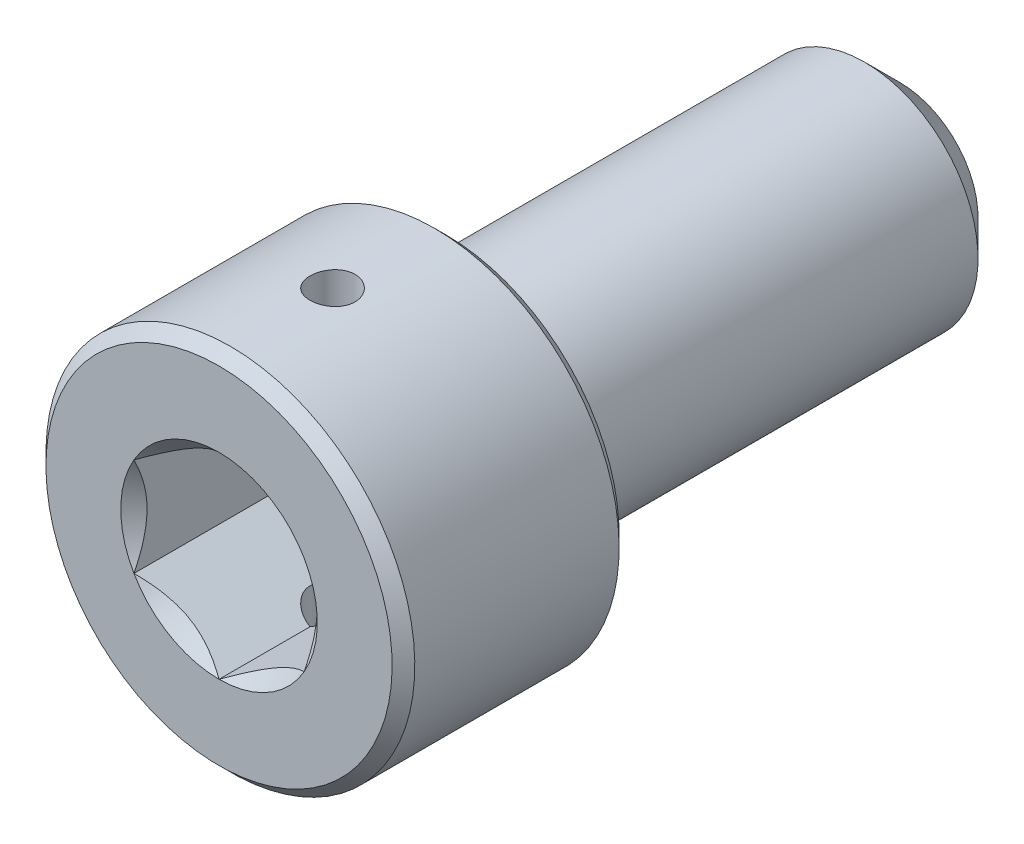
ISO-10303-21;
HEADER;
FILE_DESCRIPTION(('STEP AP214'),'2;1');
FILE_NAME('part.step','',(''),(''),'','','');
FILE_SCHEMA(('AUTOMOTIVE_DESIGN { 1 0 10303 214 1 1 1 1 }'));
ENDSEC;
DATA;
#1=APPLICATION_CONTEXT('core data for automotive mechanical design processes');
#2=APPLICATION_PROTOCOL_DEFINITION('international standard','automotive_design',2000,#1);
#3=PRODUCT_CONTEXT('',#1,'mechanical');
#4=PRODUCT('Part','Part','',(#3));
#5=PRODUCT_RELATED_PRODUCT_CATEGORY('part','',(#4));
#6=PRODUCT_DEFINITION_FORMATION('','',#4);
#7=PRODUCT_DEFINITION_CONTEXT('part definition',#1,'design');
#8=PRODUCT_DEFINITION('design','',#6,#7);
#9=PRODUCT_DEFINITION_SHAPE('','',#8);
#10=(LENGTH_UNIT() NAMED_UNIT(*) SI_UNIT(.MILLI.,.METRE.));
#11=(NAMED_UNIT(*) PLANE_ANGLE_UNIT() SI_UNIT($,.RADIAN.));
#12=(NAMED_UNIT(*) SI_UNIT($,.STERADIAN.) SOLID_ANGLE_UNIT());
#13=UNCERTAINTY_MEASURE_WITH_UNIT(LENGTH_MEASURE(1.E-05),#10,'distance_accuracy_value','');
#14=(GEOMETRIC_REPRESENTATION_CONTEXT(3) GLOBAL_UNCERTAINTY_ASSIGNED_CONTEXT((#13)) GLOBAL_UNIT_ASSIGNED_CONTEXT((#10,
#11,#12)) REPRESENTATION_CONTEXT('',''));
#15=CARTESIAN_POINT('',(0.,0.,0.));
#16=DIRECTION('',(0.,0.,1.));
#17=DIRECTION('',(1.,0.,0.));
#18=AXIS2_PLACEMENT_3D('',#15,#16,#17);
#19=CARTESIAN_POINT('',(0.,0.,-12.));
#20=DIRECTION('',(0.,0.,-1.));
#21=DIRECTION('',(0.,1.,0.));
#22=AXIS2_PLACEMENT_3D('',#19,#20,#21);
#23=CYLINDRICAL_SURFACE('',#22,6.5);
#24=CARTESIAN_POINT('',(0.,-6.5,7.20625));
#25=CARTESIAN_POINT('',(-0.0444079729155485,-6.49999939221956,7.20625189165239));
#26=CARTESIAN_POINT('',(-0.0888438999168541,-6.49954009733424,7.20998930580728));
#27=CARTESIAN_POINT('',(-0.176479831647115,-6.4977520563684,7.22483991313988));
#28=CARTESIAN_POINT('',(-0.21967848699375,-6.49642239612394,7.23596086158224));
#29=CARTESIAN_POINT('',(-0.303558433995981,-6.49304345604874,7.26524649888843));
#30=CARTESIAN_POINT('',(-0.344241377420885,-6.49099465442224,7.28340650785434));
#31=CARTESIAN_POINT('',(-0.421974268598821,-6.48640545434676,7.32624467486773));
#32=CARTESIAN_POINT('',(-0.459024850483202,-6.48386514193596,7.35092169239871));
#33=CARTESIAN_POINT('',(-0.528644217010037,-6.47856170874026,7.40623233750422));
#34=CARTESIAN_POINT('',(-0.561191129061601,-6.47579759729589,7.43689340381851));
#35=CARTESIAN_POINT('',(-0.620690939663912,-6.47036611160896,7.50324291360889));
#36=CARTESIAN_POINT('',(-0.647643556590281,-6.46769874224212,7.53893161003093));
#37=CARTESIAN_POINT('',(-0.695270708290707,-6.46275296282142,7.61446485426336));
#38=CARTESIAN_POINT('',(-0.715924830922818,-6.46047582766464,7.6543223635235));
#39=CARTESIAN_POINT('',(-0.750238346328536,-6.45658132712623,7.73697262771977));
#40=CARTESIAN_POINT('',(-0.763897992513902,-6.45496393784227,7.77976527625132));
#41=CARTESIAN_POINT('',(-0.783768525893049,-6.45258146551916,7.86684450333741));
#42=CARTESIAN_POINT('',(-0.790016274996747,-6.45181216600249,7.91112255304096));
#43=CARTESIAN_POINT('',(-0.794999712296952,-6.4512000530219,8.00010487217156));
#44=CARTESIAN_POINT('',(-0.79373568927032,-6.45135720394222,8.04480912514802));
#45=CARTESIAN_POINT('',(-0.783761737577462,-6.45257637760844,8.13311831925809));
#46=CARTESIAN_POINT('',(-0.775092368401077,-6.45363347121317,8.17672791903204));
#47=CARTESIAN_POINT('',(-0.750617076783878,-6.45652573353287,8.26186863690291));
#48=CARTESIAN_POINT('',(-0.734811015788588,-6.45836091735395,8.3033997146292));
#49=CARTESIAN_POINT('',(-0.696467273197893,-6.46260818144597,8.38333074451698));
#50=CARTESIAN_POINT('',(-0.67391191957528,-6.46502177284685,8.42172213565406));
#51=CARTESIAN_POINT('',(-0.622722504352283,-6.4701527204516,8.4941902076965));
#52=CARTESIAN_POINT('',(-0.594088177344442,-6.47287008991593,8.52826670011002));
#53=CARTESIAN_POINT('',(-0.53132863490993,-6.47832433417503,8.59137312271258));
#54=CARTESIAN_POINT('',(-0.497168450655344,-6.48106121941223,8.62036828672117));
#55=CARTESIAN_POINT('',(-0.424447406964582,-6.48622933073016,8.67221844575897));
#56=CARTESIAN_POINT('',(-0.385886538153272,-6.48866055615969,8.6950734277069));
#57=CARTESIAN_POINT('',(-0.305432260120137,-6.49294482676988,8.73399429961519));
#58=CARTESIAN_POINT('',(-0.263537812864568,-6.4947976909651,8.75005806496976));
#59=CARTESIAN_POINT('',(-0.177618561675765,-6.49771480868667,8.77491318171684));
#60=CARTESIAN_POINT('',(-0.133593852994679,-6.4987790974386,8.78370485795483));
#61=CARTESIAN_POINT('',(-0.0449644430967683,-6.4999945762374,8.79372129420934));
#62=CARTESIAN_POINT('',(-0.000365231700197217,-6.50015154653819,8.7949939567614));
#63=CARTESIAN_POINT('',(0.0884108371981461,-6.49955029509486,8.79006257893541));
#64=CARTESIAN_POINT('',(0.132587703256742,-6.49879209193216,8.78385869035915));
#65=CARTESIAN_POINT('',(0.219124107656301,-6.49644929915982,8.76419010425553));
#66=CARTESIAN_POINT('',(0.2614889017487,-6.49486730373612,8.75074819531731));
#67=CARTESIAN_POINT('',(0.343362876537072,-6.49105408547658,8.71700879285049));
#68=CARTESIAN_POINT('',(0.382871964266297,-6.4888228415165,8.69671107625484));
#69=CARTESIAN_POINT('',(0.458127279555294,-6.48394557258654,8.64971997271041));
#70=CARTESIAN_POINT('',(0.493853988825558,-6.48129755630257,8.6229955378111));
#71=CARTESIAN_POINT('',(0.560331944427385,-6.47588933049109,8.56395360522));
#72=CARTESIAN_POINT('',(0.591083002505686,-6.47312911672355,8.53163589600293));
#73=CARTESIAN_POINT('',(0.646906246143568,-6.46778980998977,8.46211403578312));
#74=CARTESIAN_POINT('',(0.671946717311331,-6.46521178089084,8.42488432584338));
#75=CARTESIAN_POINT('',(0.715419021008601,-6.46054608123354,8.34671956096686));
#76=CARTESIAN_POINT('',(0.733850980891948,-6.45845840122583,8.30578457745413));
#77=CARTESIAN_POINT('',(0.763531479775983,-6.45501695438462,8.22147440028328));
#78=CARTESIAN_POINT('',(0.774798024233719,-6.45366134927783,8.17810562348062));
#79=CARTESIAN_POINT('',(0.789885918467963,-6.45183221600156,8.0900741846122));
#80=CARTESIAN_POINT('',(0.793707597549751,-6.45135864881735,8.04541157986442));
#81=CARTESIAN_POINT('',(0.793791423265528,-6.45134830984382,7.95637576479737));
#82=CARTESIAN_POINT('',(0.790103392774313,-6.45180536388326,7.91200259383992));
#83=CARTESIAN_POINT('',(0.775377862822732,-6.45359150880796,7.824511754986));
#84=CARTESIAN_POINT('',(0.76434036148339,-6.45492059991616,7.78139408741051));
#85=CARTESIAN_POINT('',(0.735244558270641,-6.45829917942211,7.69764399596792));
#86=CARTESIAN_POINT('',(0.717188540715948,-6.46034843340743,7.65701076846398));
#87=CARTESIAN_POINT('',(0.674573164631947,-6.46493683843091,7.57934297473241));
#88=CARTESIAN_POINT('',(0.650013739340728,-6.46747599449817,7.5423084454532));
#89=CARTESIAN_POINT('',(0.594903512728122,-6.47277829353947,7.47263451789079));
#90=CARTESIAN_POINT('',(0.564315567679773,-6.47554275944227,7.44002459808981));
#91=CARTESIAN_POINT('',(0.498093754356882,-6.48097245227142,7.38038111468983));
#92=CARTESIAN_POINT('',(0.462458695913658,-6.48363765560272,7.35334887007675));
#93=CARTESIAN_POINT('',(0.387006293466619,-6.48857916507216,7.30554505173688));
#94=CARTESIAN_POINT('',(0.347174219029583,-6.49085402249052,7.2847965905581));
#95=CARTESIAN_POINT('',(0.264586060022864,-6.49474374491224,7.25031241759395));
#96=CARTESIAN_POINT('',(0.221833226028691,-6.49635933010261,7.23656904935486));
#97=CARTESIAN_POINT('',(0.149047066124777,-6.49835692423046,7.21979236925573));
#98=CARTESIAN_POINT('',(0.119473583368739,-6.49897009224667,7.21472123337664));
#99=CARTESIAN_POINT('',(0.0599376440854188,-6.49979183385601,7.20794942198299));
#100=CARTESIAN_POINT('',(0.0299751902515168,-6.50000041024918,7.20624872314279));
#101=CARTESIAN_POINT('',(0.,-6.5,7.20625));
#102=B_SPLINE_CURVE_WITH_KNOTS('',3,(#24,#25,#26,#27,#28,#29,#30,#31,#32,#33,#34,#35,#36,#37,
#38,#39,#40,#41,#42,#43,#44,#45,#46,#47,#48,#49,#50,#51,#52,#53,#54,#55,#56,#57,#58,#59,#60,#61,
#62,#63,#64,#65,#66,#67,#68,#69,#70,#71,#72,#73,#74,#75,#76,#77,#78,#79,#80,#81,#82,#83,#84,#85,
#86,#87,#88,#89,#90,#91,#92,#93,#94,#95,#96,#97,#98,#99,#100,#101),.UNSPECIFIED.,.T.,.F.,(4,2,2,
2,2,2,2,2,2,2,2,2,2,2,2,2,2,2,2,2,2,2,2,2,2,2,2,2,2,2,2,2,2,2,2,2,2,2,4),(0.,0.133114432934167,
0.266368903720819,0.399534932218744,0.532677671269972,0.666445897170282,0.800220855511473,
0.93442485355405,1.06862398900565,1.20215287011592,1.33567661797657,1.4684737038826,
1.60127336807312,1.73442383732924,1.86758012111941,2.0016146185421,2.13564940151465,
2.26972608577511,2.40379678048337,2.53701240144547,2.67022531768106,2.80302125051211,
2.93582150453355,3.06927669165344,3.20273692685682,3.33692121681087,3.47110292073573,
3.60494610285574,3.73878336461785,3.87173558167988,4.00468783273269,4.13759684795729,
4.27050722763638,4.40426366614131,4.53805169866482,4.67232600564711,4.80645323656826,
4.89630552671037,4.98615719501355),.UNSPECIFIED.);
#103=CARTESIAN_POINT('',(0.,-6.5,7.20625));
#104=VERTEX_POINT('',#103);
#105=EDGE_CURVE('E248',#104,#104,#102,.T.);
#106=ORIENTED_EDGE('',*,*,#105,.T.);
#107=EDGE_LOOP('',(#106));
#108=FACE_BOUND('',#107,.T.);
#109=CARTESIAN_POINT('',(0.,0.,11.6));
#110=DIRECTION('',(0.,0.,-1.));
#111=DIRECTION('',(0.,1.,0.));
#112=AXIS2_PLACEMENT_3D('',#109,#110,#111);
#113=CIRCLE('',#112,6.5);
#114=CARTESIAN_POINT('',(0.,6.5,11.6));
#115=VERTEX_POINT('',#114);
#116=EDGE_CURVE('E146',#115,#115,#113,.T.);
#117=ORIENTED_EDGE('',*,*,#116,.T.);
#118=EDGE_LOOP('',(#117));
#119=FACE_BOUND('',#118,.T.);
#120=CARTESIAN_POINT('',(0.,0.,4.4));
#121=DIRECTION('',(0.,0.,-1.));
#122=DIRECTION('',(0.,1.,0.));
#123=AXIS2_PLACEMENT_3D('',#120,#121,#122);
#124=CIRCLE('',#123,6.5);
#125=CARTESIAN_POINT('',(0.,6.5,4.4));
#126=VERTEX_POINT('',#125);
#127=EDGE_CURVE('E143',#126,#126,#124,.T.);
#128=ORIENTED_EDGE('',*,*,#127,.F.);
#129=EDGE_LOOP('',(#128));
#130=FACE_BOUND('',#129,.T.);
#131=CARTESIAN_POINT('',(0.,6.5,8.79375));
#132=CARTESIAN_POINT('',(-0.0444079729155484,6.49999939221956,8.79374810834761));
#133=CARTESIAN_POINT('',(-0.0888438999168541,6.49954009733424,8.79001069419272));
#134=CARTESIAN_POINT('',(-0.176479831647115,6.4977520563684,8.77516008686012));
#135=CARTESIAN_POINT('',(-0.219678486993749,6.49642239612394,8.76403913841776));
#136=CARTESIAN_POINT('',(-0.303558433995981,6.49304345604874,8.73475350111156));
#137=CARTESIAN_POINT('',(-0.344241377420886,6.49099465442224,8.71659349214566));
#138=CARTESIAN_POINT('',(-0.421974268598822,6.48640545434676,8.67375532513227));
#139=CARTESIAN_POINT('',(-0.459024850483202,6.48386514193596,8.64907830760129));
#140=CARTESIAN_POINT('',(-0.528644217010037,6.47856170874026,8.59376766249578));
#141=CARTESIAN_POINT('',(-0.561191129061602,6.47579759729589,8.56310659618149));
#142=CARTESIAN_POINT('',(-0.620690939663913,6.47036611160896,8.49675708639111));
#143=CARTESIAN_POINT('',(-0.647643556590282,6.46769874224212,8.46106838996907));
#144=CARTESIAN_POINT('',(-0.695270708290708,6.46275296282142,8.38553514573664));
#145=CARTESIAN_POINT('',(-0.715924830922819,6.46047582766464,8.3456776364765));
#146=CARTESIAN_POINT('',(-0.750238346328536,6.45658132712623,8.26302737228023));
#147=CARTESIAN_POINT('',(-0.763897992513902,6.45496393784227,8.22023472374868));
#148=CARTESIAN_POINT('',(-0.783768525893049,6.45258146551916,8.13315549666259));
#149=CARTESIAN_POINT('',(-0.790016274996747,6.45181216600249,8.08887744695904));
#150=CARTESIAN_POINT('',(-0.794999712296952,6.4512000530219,7.99989512782844));
#151=CARTESIAN_POINT('',(-0.79373568927032,6.45135720394222,7.95519087485198));
#152=CARTESIAN_POINT('',(-0.783761737577462,6.45257637760844,7.86688168074191));
#153=CARTESIAN_POINT('',(-0.775092368401077,6.45363347121317,7.82327208096796));
#154=CARTESIAN_POINT('',(-0.750617076783878,6.45652573353287,7.7381313630971));
#155=CARTESIAN_POINT('',(-0.734811015788588,6.45836091735395,7.6966002853708));
#156=CARTESIAN_POINT('',(-0.696467273197894,6.46260818144597,7.61666925548302));
#157=CARTESIAN_POINT('',(-0.673911919575281,6.46502177284685,7.57827786434594));
#158=CARTESIAN_POINT('',(-0.622722504352283,6.4701527204516,7.5058097923035));
#159=CARTESIAN_POINT('',(-0.594088177344442,6.47287008991593,7.47173329988998));
#160=CARTESIAN_POINT('',(-0.53132863490993,6.47832433417503,7.40862687728742));
#161=CARTESIAN_POINT('',(-0.497168450655344,6.48106121941223,7.37963171327883));
#162=CARTESIAN_POINT('',(-0.424447406964582,6.48622933073016,7.32778155424103));
#163=CARTESIAN_POINT('',(-0.385886538153272,6.48866055615969,7.3049265722931));
#164=CARTESIAN_POINT('',(-0.305432260120137,6.49294482676988,7.26600570038481));
#165=CARTESIAN_POINT('',(-0.263537812864568,6.4947976909651,7.24994193503024));
#166=CARTESIAN_POINT('',(-0.177618561675765,6.49771480868667,7.22508681828316));
#167=CARTESIAN_POINT('',(-0.133593852994679,6.4987790974386,7.21629514204517));
#168=CARTESIAN_POINT('',(-0.044964443096767,6.4999945762374,7.20627870579066));
#169=CARTESIAN_POINT('',(-0.000365231700196106,6.50015154653819,7.20500604323861));
#170=CARTESIAN_POINT('',(0.0884108371981468,6.49955029509486,7.20993742106459));
#171=CARTESIAN_POINT('',(0.132587703256743,6.49879209193216,7.21614130964085));
#172=CARTESIAN_POINT('',(0.219124107656302,6.49644929915982,7.23580989574447));
#173=CARTESIAN_POINT('',(0.261488901748701,6.49486730373612,7.24925180468269));
#174=CARTESIAN_POINT('',(0.343362876537073,6.49105408547658,7.28299120714952));
#175=CARTESIAN_POINT('',(0.382871964266298,6.4888228415165,7.30328892374516));
#176=CARTESIAN_POINT('',(0.458127279555295,6.48394557258654,7.35028002728959));
#177=CARTESIAN_POINT('',(0.493853988825559,6.48129755630257,7.3770044621889));
#178=CARTESIAN_POINT('',(0.560331944427387,6.47588933049109,7.43604639478));
#179=CARTESIAN_POINT('',(0.591083002505687,6.47312911672355,7.46836410399707));
#180=CARTESIAN_POINT('',(0.646906246143568,6.46778980998977,7.53788596421688));
#181=CARTESIAN_POINT('',(0.671946717311331,6.46521178089084,7.57511567415662));
#182=CARTESIAN_POINT('',(0.715419021008601,6.46054608123354,7.65328043903314));
#183=CARTESIAN_POINT('',(0.733850980891947,6.45845840122583,7.69421542254587));
#184=CARTESIAN_POINT('',(0.763531479775983,6.45501695438462,7.77852559971672));
#185=CARTESIAN_POINT('',(0.774798024233719,6.45366134927783,7.82189437651938));
#186=CARTESIAN_POINT('',(0.789885918467963,6.45183221600156,7.9099258153878));
#187=CARTESIAN_POINT('',(0.793707597549751,6.45135864881735,7.95458842013558));
#188=CARTESIAN_POINT('',(0.793791423265528,6.45134830984382,8.04362423520263));
#189=CARTESIAN_POINT('',(0.790103392774313,6.45180536388326,8.08799740616008));
#190=CARTESIAN_POINT('',(0.775377862822732,6.45359150880796,8.175488245014));
#191=CARTESIAN_POINT('',(0.76434036148339,6.45492059991616,8.21860591258949));
#192=CARTESIAN_POINT('',(0.735244558270641,6.45829917942211,8.30235600403208));
#193=CARTESIAN_POINT('',(0.717188540715949,6.46034843340743,8.34298923153602));
#194=CARTESIAN_POINT('',(0.674573164631948,6.46493683843091,8.42065702526759));
#195=CARTESIAN_POINT('',(0.650013739340728,6.46747599449817,8.4576915545468));
#196=CARTESIAN_POINT('',(0.59490351272812,6.47277829353947,8.52736548210921));
#197=CARTESIAN_POINT('',(0.564315567679772,6.47554275944227,8.55997540191019));
#198=CARTESIAN_POINT('',(0.498093754356881,6.48097245227142,8.61961888531017));
#199=CARTESIAN_POINT('',(0.462458695913657,6.48363765560272,8.64665112992325));
#200=CARTESIAN_POINT('',(0.387006293466618,6.48857916507216,8.69445494826312));
#201=CARTESIAN_POINT('',(0.347174219029583,6.49085402249052,8.7152034094419));
#202=CARTESIAN_POINT('',(0.264586060022864,6.49474374491224,8.74968758240606));
#203=CARTESIAN_POINT('',(0.221833226028691,6.49635933010261,8.76343095064514));
#204=CARTESIAN_POINT('',(0.149047066124777,6.49835692423046,8.78020763074427));
#205=CARTESIAN_POINT('',(0.119473583368739,6.49897009224667,8.78527876662336));
#206=CARTESIAN_POINT('',(0.059937644085419,6.49979183385601,8.79205057801701));
#207=CARTESIAN_POINT('',(0.029975190251517,6.50000041024918,8.79375127685721));
#208=CARTESIAN_POINT('',(0.,6.5,8.79375));
#209=B_SPLINE_CURVE_WITH_KNOTS('',3,(#131,#132,#133,#134,#135,#136,#137,#138,#139,#140,#141,
#142,#143,#144,#145,#146,#147,#148,#149,#150,#151,#152,#153,#154,#155,#156,#157,#158,#159,#160,
#161,#162,#163,#164,#165,#166,#167,#168,#169,#170,#171,#172,#173,#174,#175,#176,#177,#178,#179,
#180,#181,#182,#183,#184,#185,#186,#187,#188,#189,#190,#191,#192,#193,#194,#195,#196,#197,#198,
#199,#200,#201,#202,#203,#204,#205,#206,#207,#208),.UNSPECIFIED.,.T.,.F.,(4,2,2,2,2,2,2,2,2,2,2,
2,2,2,2,2,2,2,2,2,2,2,2,2,2,2,2,2,2,2,2,2,2,2,2,2,2,2,4),(0.,0.133114432934167,0.26636890372082,
0.399534932218745,0.532677671269972,0.666445897170285,0.800220855511474,0.934424853554051,
1.06862398900565,1.20215287011592,1.33567661797657,1.4684737038826,1.60127336807312,
1.73442383732924,1.86758012111941,2.0016146185421,2.13564940151465,2.26972608577511,
2.40379678048337,2.53701240144547,2.67022531768106,2.80302125051211,2.93582150453355,
3.06927669165344,3.20273692685682,3.33692121681087,3.47110292073573,3.60494610285574,
3.73878336461785,3.87173558167988,4.00468783273269,4.13759684795729,4.27050722763638,
4.4042636661413,4.53805169866482,4.67232600564711,4.80645323656826,4.89630552671037,
4.98615719501355),.UNSPECIFIED.);
#210=CARTESIAN_POINT('',(0.,6.5,8.79375));
#211=VERTEX_POINT('',#210);
#212=EDGE_CURVE('E254',#211,#211,#209,.T.);
#213=ORIENTED_EDGE('',*,*,#212,.T.);
#214=EDGE_LOOP('',(#213));
#215=FACE_BOUND('',#214,.T.);
#216=ADVANCED_FACE('F35',(#108,#119,#130,#215),#23,.T.);
#217=CARTESIAN_POINT('',(0.,0.,12.));
#218=DIRECTION('',(0.,0.,1.));
#219=DIRECTION('',(0.,-1.,0.));
#220=AXIS2_PLACEMENT_3D('',#217,#218,#219);
#221=PLANE('',#220);
#222=CARTESIAN_POINT('',(0.,0.,12.));
#223=DIRECTION('',(0.,0.,1.));
#224=DIRECTION('',(1.,0.,0.));
#225=AXIS2_PLACEMENT_3D('',#222,#223,#224);
#226=CIRCLE('',#225,3.46410161513775);
#227=CARTESIAN_POINT('',(0.,-3.46410161513776,12.));
#228=VERTEX_POINT('',#227);
#229=CARTESIAN_POINT('',(3.,-1.73205080756888,12.));
#230=VERTEX_POINT('',#229);
#231=EDGE_CURVE('E267',#228,#230,#226,.T.);
#232=ORIENTED_EDGE('',*,*,#231,.F.);
#233=CARTESIAN_POINT('',(-3.,-1.73205080756888,12.));
#234=VERTEX_POINT('',#233);
#235=EDGE_CURVE('E270',#234,#228,#226,.T.);
#236=ORIENTED_EDGE('',*,*,#235,.F.);
#237=CARTESIAN_POINT('',(-3.,1.73205080756888,12.));
#238=VERTEX_POINT('',#237);
#239=EDGE_CURVE('E266',#238,#234,#226,.T.);
#240=ORIENTED_EDGE('',*,*,#239,.F.);
#241=CARTESIAN_POINT('',(0.,3.46410161513775,12.));
#242=VERTEX_POINT('',#241);
#243=EDGE_CURVE('E261',#242,#238,#226,.T.);
#244=ORIENTED_EDGE('',*,*,#243,.F.);
#245=CARTESIAN_POINT('',(3.,1.73205080756888,12.));
#246=VERTEX_POINT('',#245);
#247=EDGE_CURVE('E260',#246,#242,#226,.T.);
#248=ORIENTED_EDGE('',*,*,#247,.F.);
#249=EDGE_CURVE('E259',#230,#246,#226,.T.);
#250=ORIENTED_EDGE('',*,*,#249,.F.);
#251=EDGE_LOOP('',(#232,#236,#240,#244,#248,#250));
#252=FACE_BOUND('',#251,.T.);
#253=CARTESIAN_POINT('',(0.,0.,12.));
#254=DIRECTION('',(0.,0.,-1.));
#255=DIRECTION('',(0.,1.,0.));
#256=AXIS2_PLACEMENT_3D('',#253,#254,#255);
#257=CIRCLE('',#256,6.1);
#258=CARTESIAN_POINT('',(0.,6.1,12.));
#259=VERTEX_POINT('',#258);
#260=EDGE_CURVE('E149',#259,#259,#257,.T.);
#261=ORIENTED_EDGE('',*,*,#260,.F.);
#262=EDGE_LOOP('',(#261));
#263=FACE_BOUND('',#262,.T.);
#264=ADVANCED_FACE('F37',(#252,#263),#221,.T.);
#265=CARTESIAN_POINT('',(0.,0.,11.6));
#266=DIRECTION('',(0.,0.,-1.));
#267=DIRECTION('',(0.,1.,0.));
#268=AXIS2_PLACEMENT_3D('',#265,#266,#267);
#269=CONICAL_SURFACE('',#268,6.5,0.785398163397452);
#270=ORIENTED_EDGE('',*,*,#260,.T.);
#271=EDGE_LOOP('',(#270));
#272=FACE_BOUND('',#271,.T.);
#273=ORIENTED_EDGE('',*,*,#116,.F.);
#274=EDGE_LOOP('',(#273));
#275=FACE_BOUND('',#274,.T.);
#276=ADVANCED_FACE('F241',(#272,#275),#269,.T.);
#277=CARTESIAN_POINT('',(0.,0.,4.));
#278=DIRECTION('',(0.,0.,1.));
#279=DIRECTION('',(0.,-1.,0.));
#280=AXIS2_PLACEMENT_3D('',#277,#278,#279);
#281=CONICAL_SURFACE('',#280,6.1,0.785398163397447);
#282=ORIENTED_EDGE('',*,*,#127,.T.);
#283=EDGE_LOOP('',(#282));
#284=FACE_BOUND('',#283,.T.);
#285=CARTESIAN_POINT('',(0.,0.,4.));
#286=DIRECTION('',(0.,0.,-1.));
#287=DIRECTION('',(0.,1.,0.));
#288=AXIS2_PLACEMENT_3D('',#285,#286,#287);
#289=CIRCLE('',#288,6.1);
#290=CARTESIAN_POINT('',(0.,6.1,4.));
#291=VERTEX_POINT('',#290);
#292=EDGE_CURVE('E140',#291,#291,#289,.T.);
#293=ORIENTED_EDGE('',*,*,#292,.F.);
#294=EDGE_LOOP('',(#293));
#295=FACE_BOUND('',#294,.T.);
#296=ADVANCED_FACE('F237',(#284,#295),#281,.T.);
#297=CARTESIAN_POINT('',(0.,6.1,4.));
#298=DIRECTION('',(0.,0.,-1.));
#299=DIRECTION('',(0.,1.,0.));
#300=AXIS2_PLACEMENT_3D('',#297,#298,#299);
#301=PLANE('',#300);
#302=ORIENTED_EDGE('',*,*,#292,.T.);
#303=EDGE_LOOP('',(#302));
#304=FACE_BOUND('',#303,.T.);
#305=CARTESIAN_POINT('',(0.,0.,4.));
#306=DIRECTION('',(0.,0.,-1.));
#307=DIRECTION('',(0.,1.,0.));
#308=AXIS2_PLACEMENT_3D('',#305,#306,#307);
#309=CIRCLE('',#308,4.);
#310=CARTESIAN_POINT('',(0.,4.,4.));
#311=VERTEX_POINT('',#310);
#312=EDGE_CURVE('E137',#311,#311,#309,.T.);
#313=ORIENTED_EDGE('',*,*,#312,.F.);
#314=EDGE_LOOP('',(#313));
#315=FACE_BOUND('',#314,.T.);
#316=ADVANCED_FACE('F233',(#304,#315),#301,.T.);
#317=CARTESIAN_POINT('',(0.,0.,-12.));
#318=DIRECTION('',(0.,0.,-1.));
#319=DIRECTION('',(0.,1.,0.));
#320=AXIS2_PLACEMENT_3D('',#317,#318,#319);
#321=CYLINDRICAL_SURFACE('',#320,4.);
#322=ORIENTED_EDGE('',*,*,#312,.T.);
#323=EDGE_LOOP('',(#322));
#324=FACE_BOUND('',#323,.T.);
#325=CARTESIAN_POINT('',(0.,0.,-10.75));
#326=DIRECTION('',(0.,0.,-1.));
#327=DIRECTION('',(0.,1.,0.));
#328=AXIS2_PLACEMENT_3D('',#325,#326,#327);
#329=CIRCLE('',#328,4.);
#330=CARTESIAN_POINT('',(0.,4.,-10.75));
#331=VERTEX_POINT('',#330);
#332=EDGE_CURVE('E134',#331,#331,#329,.T.);
#333=ORIENTED_EDGE('',*,*,#332,.F.);
#334=EDGE_LOOP('',(#333));
#335=FACE_BOUND('',#334,.T.);
#336=ADVANCED_FACE('F229',(#324,#335),#321,.T.);
#337=CARTESIAN_POINT('',(0.,0.,-12.));
#338=DIRECTION('',(0.,0.,1.));
#339=DIRECTION('',(0.,-1.,0.));
#340=AXIS2_PLACEMENT_3D('',#337,#338,#339);
#341=CONICAL_SURFACE('',#340,2.75,0.785398163397443);
#342=ORIENTED_EDGE('',*,*,#332,.T.);
#343=EDGE_LOOP('',(#342));
#344=FACE_BOUND('',#343,.T.);
#345=CARTESIAN_POINT('',(0.,0.,-12.));
#346=DIRECTION('',(0.,0.,-1.));
#347=DIRECTION('',(0.,1.,0.));
#348=AXIS2_PLACEMENT_3D('',#345,#346,#347);
#349=CIRCLE('',#348,2.75);
#350=CARTESIAN_POINT('',(0.,2.75,-12.));
#351=VERTEX_POINT('',#350);
#352=EDGE_CURVE('E130',#351,#351,#349,.T.);
#353=ORIENTED_EDGE('',*,*,#352,.F.);
#354=EDGE_LOOP('',(#353));
#355=FACE_BOUND('',#354,.T.);
#356=ADVANCED_FACE('F225',(#344,#355),#341,.T.);
#357=CARTESIAN_POINT('',(0.,2.75,-12.));
#358=DIRECTION('',(0.,0.,-1.));
#359=DIRECTION('',(0.,1.,0.));
#360=AXIS2_PLACEMENT_3D('',#357,#358,#359);
#361=PLANE('',#360);
#362=ORIENTED_EDGE('',*,*,#352,.T.);
#363=EDGE_LOOP('',(#362));
#364=FACE_BOUND('',#363,.T.);
#365=ADVANCED_FACE('F222',(#364),#361,.T.);
#366=CARTESIAN_POINT('',(0.,0.,12.));
#367=DIRECTION('',(0.,0.,1.));
#368=DIRECTION('',(1.,0.,0.));
#369=AXIS2_PLACEMENT_3D('',#366,#367,#368);
#370=CONICAL_SURFACE('',#369,3.46410161513775,0.78539816339745);
#371=ORIENTED_EDGE('',*,*,#231,.T.);
#372=CARTESIAN_POINT('',(-0.000199999999999171,-3.46421708519159,12.0001154758271));
#373=CARTESIAN_POINT('',(0.102923514955749,-3.40467869607211,11.9406283183218));
#374=CARTESIAN_POINT('',(0.207771389330651,-3.3441447475778,11.8846349794655));
#375=CARTESIAN_POINT('',(0.421567671781097,-3.2207094063533,11.7821125963789));
#376=CARTESIAN_POINT('',(0.530536411379761,-3.15779627521275,11.7356405937413));
#377=CARTESIAN_POINT('',(0.75026663959703,-3.03093496880241,11.6560331885163));
#378=CARTESIAN_POINT('',(0.860972171762213,-2.96701910000606,11.6226977006427));
#379=CARTESIAN_POINT('',(1.08482041056533,-2.83778025907546,11.5713375439793));
#380=CARTESIAN_POINT('',(1.19795627920699,-2.77246123486019,11.5532745375356));
#381=CARTESIAN_POINT('',(1.3929409561927,-2.65988677911464,11.5369769084505));
#382=CARTESIAN_POINT('',(1.47453795400214,-2.6127767304643,11.5345643671738));
#383=CARTESIAN_POINT('',(1.63759922883009,-2.51863325954798,11.5386294346571));
#384=CARTESIAN_POINT('',(1.71906344929899,-2.47159986993094,11.5451101600283));
#385=CARTESIAN_POINT('',(1.88122011233837,-2.37797867687426,11.5665917225152));
#386=CARTESIAN_POINT('',(1.9619115887843,-2.33139143122689,11.5816020899673));
#387=CARTESIAN_POINT('',(2.12190869789134,-2.23901705721438,11.619323646066));
#388=CARTESIAN_POINT('',(2.2012144363093,-2.19322986779049,11.6420342443228));
#389=CARTESIAN_POINT('',(2.34200614080275,-2.11194373930153,11.6887606848539));
#390=CARTESIAN_POINT('',(2.40380372214603,-2.07626488907772,11.7115483276808));
#391=CARTESIAN_POINT('',(2.52628941752022,-2.00554773988155,11.7607962860574));
#392=CARTESIAN_POINT('',(2.5869774976356,-1.97050946049033,11.7872567136662));
#393=CARTESIAN_POINT('',(2.70705299739086,-1.90118383838356,11.8432569943914));
#394=CARTESIAN_POINT('',(2.76644383229592,-1.86689452386373,11.8727871644784));
#395=CARTESIAN_POINT('',(2.88412556146727,-1.79895094584795,11.9345390915755));
#396=CARTESIAN_POINT('',(2.94241710424774,-1.76529630793217,11.9667591966594));
#397=CARTESIAN_POINT('',(3.0002,-1.73193533751504,12.0001154758271));
#398=B_SPLINE_CURVE_WITH_KNOTS('',3,(#372,#373,#374,#375,#376,#377,#378,#379,#380,#381,#382,
#383,#384,#385,#386,#387,#388,#389,#390,#391,#392,#393,#394,#395,#396,#397),.UNSPECIFIED.,.F.,
.F.,(4,2,2,2,2,2,2,2,2,2,2,2,4),(0.,0.399603557139306,0.801535286397845,1.19708369162343,
1.59163620080173,1.87398941755844,2.15644160919093,2.43921001247425,2.72195674032138,
2.94657516661927,3.17120044767274,3.3951375283781,3.61893808380739),.UNSPECIFIED.);
#399=EDGE_CURVE('E43',#228,#230,#398,.T.);
#400=ORIENTED_EDGE('',*,*,#399,.F.);
#401=EDGE_LOOP('',(#371,#400));
#402=FACE_BOUND('',#401,.T.);
#403=ADVANCED_FACE('F168',(#402),#370,.F.);
#404=ORIENTED_EDGE('',*,*,#235,.T.);
#405=CARTESIAN_POINT('',(-3.0002,-1.73193533751504,12.0001154758271));
#406=CARTESIAN_POINT('',(-2.89707648504425,-1.79147372663452,11.9406283183218));
#407=CARTESIAN_POINT('',(-2.79222861066935,-1.85200767512883,11.8846349794655));
#408=CARTESIAN_POINT('',(-2.5784323282189,-1.97544301635334,11.7821125963789));
#409=CARTESIAN_POINT('',(-2.46946358862024,-2.03835614749388,11.7356405937413));
#410=CARTESIAN_POINT('',(-2.24973336040297,-2.16521745390422,11.6560331885163));
#411=CARTESIAN_POINT('',(-2.13902782823779,-2.22913332270057,11.6226977006427));
#412=CARTESIAN_POINT('',(-1.91517958943467,-2.35837216363117,11.5713375439793));
#413=CARTESIAN_POINT('',(-1.802043720793,-2.42369118784644,11.5532745375356));
#414=CARTESIAN_POINT('',(-1.60705904380729,-2.53626564359199,11.5369769084505));
#415=CARTESIAN_POINT('',(-1.52546204599786,-2.58337569224233,11.5345643671738));
#416=CARTESIAN_POINT('',(-1.36240077116991,-2.67751916315866,11.5386294346571));
#417=CARTESIAN_POINT('',(-1.28093655070101,-2.7245525527757,11.5451101600283));
#418=CARTESIAN_POINT('',(-1.11877988766163,-2.81817374583238,11.5665917225152));
#419=CARTESIAN_POINT('',(-1.03808841121569,-2.86476099147974,11.5816020899673));
#420=CARTESIAN_POINT('',(-0.87809130210866,-2.95713536549225,11.619323646066));
#421=CARTESIAN_POINT('',(-0.798785563690699,-3.00292255491614,11.6420342443228));
#422=CARTESIAN_POINT('',(-0.657993859197243,-3.08420868340511,11.6887606848539));
#423=CARTESIAN_POINT('',(-0.59619627785397,-3.11988753362891,11.7115483276808));
#424=CARTESIAN_POINT('',(-0.473710582479777,-3.19060468282508,11.7607962860574));
#425=CARTESIAN_POINT('',(-0.413022502364393,-3.2256429622163,11.7872567136662));
#426=CARTESIAN_POINT('',(-0.292947002609134,-3.29496858432308,11.8432569943914));
#427=CARTESIAN_POINT('',(-0.233556167704079,-3.32925789884291,11.8727871644784));
#428=CARTESIAN_POINT('',(-0.115874438532729,-3.39720147685869,11.9345390915755));
#429=CARTESIAN_POINT('',(-0.057582895752264,-3.43085611477447,11.9667591966594));
#430=CARTESIAN_POINT('',(0.000200000000001291,-3.46421708519159,12.0001154758271));
#431=B_SPLINE_CURVE_WITH_KNOTS('',3,(#405,#406,#407,#408,#409,#410,#411,#412,#413,#414,#415,
#416,#417,#418,#419,#420,#421,#422,#423,#424,#425,#426,#427,#428,#429,#430),.UNSPECIFIED.,.F.,
.F.,(4,2,2,2,2,2,2,2,2,2,2,2,4),(0.,0.399603557139308,0.801535286397846,1.19708369162343,
1.59163620080173,1.87398941755845,2.15644160919093,2.43921001247425,2.72195674032138,
2.94657516661927,3.17120044767274,3.3951375283781,3.61893808380739),.UNSPECIFIED.);
#432=EDGE_CURVE('E177',#234,#228,#431,.T.);
#433=ORIENTED_EDGE('',*,*,#432,.F.);
#434=EDGE_LOOP('',(#404,#433));
#435=FACE_BOUND('',#434,.T.);
#436=ADVANCED_FACE('F295',(#435),#370,.F.);
#437=ORIENTED_EDGE('',*,*,#239,.T.);
#438=CARTESIAN_POINT('',(-3.,-3.45441625939385,13.1111570325416));
#439=CARTESIAN_POINT('',(-3.,-3.37030502107637,13.0476657232794));
#440=CARTESIAN_POINT('',(-3.,-3.28572284861355,12.9847881417678));
#441=CARTESIAN_POINT('',(-3.,-3.11543086688957,12.8605352202182));
#442=CARTESIAN_POINT('',(-3.,-3.02972077988559,12.7991602612535));
#443=CARTESIAN_POINT('',(-3.,-2.8563602330365,12.6777509975778));
#444=CARTESIAN_POINT('',(-3.,-2.76869988431322,12.6177307653415));
#445=CARTESIAN_POINT('',(-3.,-2.5918912487671,12.4999306126985));
#446=CARTESIAN_POINT('',(-3.,-2.50274306770574,12.4421505340141));
#447=CARTESIAN_POINT('',(-3.,-2.31756329845857,12.3260958713429));
#448=CARTESIAN_POINT('',(-3.,-2.22143002198058,12.2679827190468));
#449=CARTESIAN_POINT('',(-3.,-2.02694739151964,12.1555968716429));
#450=CARTESIAN_POINT('',(-3.,-1.92859833207453,12.101323670026));
#451=CARTESIAN_POINT('',(-3.,-1.7296520236116,11.9977624496109));
#452=CARTESIAN_POINT('',(-3.,-1.62906211119816,11.9484604472253));
#453=CARTESIAN_POINT('',(-3.,-1.42513893302447,11.855954239299));
#454=CARTESIAN_POINT('',(-3.,-1.3218069347663,11.8127472727735));
#455=CARTESIAN_POINT('',(-3.,-1.12067434078031,11.7371396932414));
#456=CARTESIAN_POINT('',(-3.,-1.02309778507454,11.7041492645284));
#457=CARTESIAN_POINT('',(-3.,-0.825595420969993,11.6459965369441));
#458=CARTESIAN_POINT('',(-3.,-0.725669451239074,11.620834777359));
#459=CARTESIAN_POINT('',(-3.,-0.525726947792027,11.5800719953195));
#460=CARTESIAN_POINT('',(-3.,-0.425744363617326,11.5643071649568));
#461=CARTESIAN_POINT('',(-3.,-0.224710351161197,11.5426442284558));
#462=CARTESIAN_POINT('',(-3.,-0.123659109618513,11.5367444262465));
#463=CARTESIAN_POINT('',(-3.,0.0748582819677248,11.5352497065848));
#464=CARTESIAN_POINT('',(-3.,0.172321806608346,11.5392895256711));
#465=CARTESIAN_POINT('',(-3.,0.366414003342317,11.5566450472329));
#466=CARTESIAN_POINT('',(-3.,0.463042593410416,11.5699616508163));
#467=CARTESIAN_POINT('',(-3.,0.656399252511054,11.6053707356158));
#468=CARTESIAN_POINT('',(-3.,0.753099531688679,11.6276125600194));
#469=CARTESIAN_POINT('',(-3.,0.944393095040882,11.6796858906705));
#470=CARTESIAN_POINT('',(-3.,1.03898655479587,11.7095167618603));
#471=CARTESIAN_POINT('',(-3.,1.23463961000382,11.7786113636965));
#472=CARTESIAN_POINT('',(-3.,1.33547771428671,11.8184959734906));
#473=CARTESIAN_POINT('',(-3.,1.53452137874292,11.9043830232129));
#474=CARTESIAN_POINT('',(-3.,1.63272604345161,11.9503875132043));
#475=CARTESIAN_POINT('',(-3.,1.82700394280657,12.0474277014878));
#476=CARTESIAN_POINT('',(-3.,1.92306904045365,12.0984795592876));
#477=CARTESIAN_POINT('',(-3.,2.11298650428611,12.2044820100323));
#478=CARTESIAN_POINT('',(-3.,2.20683926516496,12.259431900424));
#479=CARTESIAN_POINT('',(-3.,2.38800606865125,12.3696520775105));
#480=CARTESIAN_POINT('',(-3.,2.47541308656128,12.4247703488088));
#481=CARTESIAN_POINT('',(-3.,2.64872655468151,12.5373247081957));
#482=CARTESIAN_POINT('',(-3.,2.73463289052352,12.5947609718457));
#483=CARTESIAN_POINT('',(-3.,2.90444477939853,12.7110625667455));
#484=CARTESIAN_POINT('',(-3.,2.9883609164946,12.7699124995692));
#485=CARTESIAN_POINT('',(-3.,3.15504638145619,12.8891686606219));
#486=CARTESIAN_POINT('',(-3.,3.23781601834663,12.9495744564211));
#487=CARTESIAN_POINT('',(-3.,3.32010556038988,13.0106163572189));
#488=B_SPLINE_CURVE_WITH_KNOTS('',3,(#438,#439,#440,#441,#442,#443,#444,#445,#446,#447,#448,
#449,#450,#451,#452,#453,#454,#455,#456,#457,#458,#459,#460,#461,#462,#463,#464,#465,#466,#467,
#468,#469,#470,#471,#472,#473,#474,#475,#476,#477,#478,#479,#480,#481,#482,#483,#484,#485,#486,
#487),.UNSPECIFIED.,.F.,.F.,(4,2,2,2,2,2,2,2,2,2,2,2,2,2,2,2,2,2,2,2,2,2,2,2,4),(0.,
0.316159097965336,0.632397561987884,0.951086331935232,1.26975254380525,1.60668135057622,
1.94356563154894,2.27947417466659,2.61523006286276,2.92396665219119,3.23272450446297,
3.53592945807761,3.83908227702018,4.13126225384143,4.42347061576031,4.72078712232687,
5.01807875738361,5.34314370606637,5.66831782186803,5.99456896834931,6.32076146236873,
6.63072186382905,6.94070578545817,7.24817167021369,7.55555300225563),.UNSPECIFIED.);
#489=EDGE_CURVE('E185',#238,#234,#488,.F.);
#490=ORIENTED_EDGE('',*,*,#489,.F.);
#491=EDGE_LOOP('',(#437,#490));
#492=FACE_BOUND('',#491,.T.);
#493=ADVANCED_FACE('F282',(#492),#370,.F.);
#494=ORIENTED_EDGE('',*,*,#243,.T.);
#495=CARTESIAN_POINT('',(0.000199999999999346,3.46421708519159,12.0001154758271));
#496=CARTESIAN_POINT('',(-0.102923514955749,3.40467869607211,11.9406283183218));
#497=CARTESIAN_POINT('',(-0.207771389330651,3.3441447475778,11.8846349794655));
#498=CARTESIAN_POINT('',(-0.421567671781097,3.22070940635329,11.7821125963789));
#499=CARTESIAN_POINT('',(-0.530536411379761,3.15779627521275,11.7356405937413));
#500=CARTESIAN_POINT('',(-0.75026663959703,3.03093496880241,11.6560331885163));
#501=CARTESIAN_POINT('',(-0.860972171762213,2.96701910000606,11.6226977006427));
#502=CARTESIAN_POINT('',(-1.08482041056533,2.83778025907546,11.5713375439793));
#503=CARTESIAN_POINT('',(-1.197956279207,2.77246123486019,11.5532745375356));
#504=CARTESIAN_POINT('',(-1.3929409561927,2.65988677911464,11.5369769084505));
#505=CARTESIAN_POINT('',(-1.47453795400214,2.6127767304643,11.5345643671738));
#506=CARTESIAN_POINT('',(-1.63759922883009,2.51863325954798,11.5386294346571));
#507=CARTESIAN_POINT('',(-1.71906344929899,2.47159986993093,11.5451101600283));
#508=CARTESIAN_POINT('',(-1.88122011233837,2.37797867687426,11.5665917225152));
#509=CARTESIAN_POINT('',(-1.9619115887843,2.33139143122689,11.5816020899673));
#510=CARTESIAN_POINT('',(-2.12190869789134,2.23901705721438,11.619323646066));
#511=CARTESIAN_POINT('',(-2.2012144363093,2.19322986779049,11.6420342443228));
#512=CARTESIAN_POINT('',(-2.34200614080275,2.11194373930153,11.6887606848539));
#513=CARTESIAN_POINT('',(-2.40380372214603,2.07626488907772,11.7115483276808));
#514=CARTESIAN_POINT('',(-2.52628941752022,2.00554773988155,11.7607962860574));
#515=CARTESIAN_POINT('',(-2.5869774976356,1.97050946049033,11.7872567136662));
#516=CARTESIAN_POINT('',(-2.70705299739086,1.90118383838356,11.8432569943914));
#517=CARTESIAN_POINT('',(-2.76644383229592,1.86689452386373,11.8727871644784));
#518=CARTESIAN_POINT('',(-2.88412556146727,1.79895094584795,11.9345390915755));
#519=CARTESIAN_POINT('',(-2.94241710424773,1.76529630793217,11.9667591966594));
#520=CARTESIAN_POINT('',(-3.0002,1.73193533751504,12.0001154758271));
#521=B_SPLINE_CURVE_WITH_KNOTS('',3,(#495,#496,#497,#498,#499,#500,#501,#502,#503,#504,#505,
#506,#507,#508,#509,#510,#511,#512,#513,#514,#515,#516,#517,#518,#519,#520),.UNSPECIFIED.,.F.,
.F.,(4,2,2,2,2,2,2,2,2,2,2,2,4),(0.,0.399603557139307,0.801535286397845,1.19708369162343,
1.59163620080173,1.87398941755844,2.15644160919093,2.43921001247425,2.72195674032138,
2.94657516661927,3.17120044767274,3.3951375283781,3.61893808380739),.UNSPECIFIED.);
#522=EDGE_CURVE('E192',#242,#238,#521,.T.);
#523=ORIENTED_EDGE('',*,*,#522,.F.);
#524=EDGE_LOOP('',(#494,#523));
#525=FACE_BOUND('',#524,.T.);
#526=ADVANCED_FACE('F287',(#525),#370,.F.);
#527=ORIENTED_EDGE('',*,*,#247,.T.);
#528=CARTESIAN_POINT('',(3.0002,1.73193533751504,12.0001154758271));
#529=CARTESIAN_POINT('',(2.89707648504425,1.79147372663452,11.9406283183218));
#530=CARTESIAN_POINT('',(2.79222861066935,1.85200767512883,11.8846349794655));
#531=CARTESIAN_POINT('',(2.5784323282189,1.97544301635334,11.7821125963789));
#532=CARTESIAN_POINT('',(2.46946358862024,2.03835614749388,11.7356405937413));
#533=CARTESIAN_POINT('',(2.24973336040297,2.16521745390422,11.6560331885163));
#534=CARTESIAN_POINT('',(2.13902782823779,2.22913332270057,11.6226977006427));
#535=CARTESIAN_POINT('',(1.91517958943467,2.35837216363117,11.5713375439793));
#536=CARTESIAN_POINT('',(1.802043720793,2.42369118784644,11.5532745375356));
#537=CARTESIAN_POINT('',(1.60705904380729,2.53626564359199,11.5369769084505));
#538=CARTESIAN_POINT('',(1.52546204599786,2.58337569224233,11.5345643671738));
#539=CARTESIAN_POINT('',(1.36240077116991,2.67751916315866,11.5386294346571));
#540=CARTESIAN_POINT('',(1.28093655070101,2.7245525527757,11.5451101600283));
#541=CARTESIAN_POINT('',(1.11877988766163,2.81817374583238,11.5665917225152));
#542=CARTESIAN_POINT('',(1.03808841121569,2.86476099147974,11.5816020899673));
#543=CARTESIAN_POINT('',(0.87809130210866,2.95713536549225,11.619323646066));
#544=CARTESIAN_POINT('',(0.798785563690699,3.00292255491614,11.6420342443228));
#545=CARTESIAN_POINT('',(0.657993859197242,3.08420868340511,11.6887606848539));
#546=CARTESIAN_POINT('',(0.59619627785397,3.11988753362891,11.7115483276808));
#547=CARTESIAN_POINT('',(0.473710582479776,3.19060468282508,11.7607962860574));
#548=CARTESIAN_POINT('',(0.413022502364393,3.2256429622163,11.7872567136662));
#549=CARTESIAN_POINT('',(0.292947002609134,3.29496858432308,11.8432569943914));
#550=CARTESIAN_POINT('',(0.233556167704079,3.32925789884291,11.8727871644784));
#551=CARTESIAN_POINT('',(0.115874438532729,3.39720147685869,11.9345390915755));
#552=CARTESIAN_POINT('',(0.0575828957522643,3.43085611477447,11.9667591966594));
#553=CARTESIAN_POINT('',(-0.00020000000000095,3.46421708519159,12.0001154758271));
#554=B_SPLINE_CURVE_WITH_KNOTS('',3,(#528,#529,#530,#531,#532,#533,#534,#535,#536,#537,#538,
#539,#540,#541,#542,#543,#544,#545,#546,#547,#548,#549,#550,#551,#552,#553),.UNSPECIFIED.,.F.,
.F.,(4,2,2,2,2,2,2,2,2,2,2,2,4),(0.,0.399603557139308,0.801535286397848,1.19708369162343,
1.59163620080173,1.87398941755845,2.15644160919093,2.43921001247426,2.72195674032139,
2.94657516661927,3.17120044767275,3.3951375283781,3.61893808380739),.UNSPECIFIED.);
#555=EDGE_CURVE('E113',#246,#242,#554,.T.);
#556=ORIENTED_EDGE('',*,*,#555,.F.);
#557=EDGE_LOOP('',(#527,#556));
#558=FACE_BOUND('',#557,.T.);
#559=ADVANCED_FACE('F166',(#558),#370,.F.);
#560=ORIENTED_EDGE('',*,*,#249,.T.);
#561=CARTESIAN_POINT('',(3.,-3.45441625939385,13.1111570325416));
#562=CARTESIAN_POINT('',(3.,-3.37030502107637,13.0476657232794));
#563=CARTESIAN_POINT('',(3.,-3.28572284861355,12.9847881417678));
#564=CARTESIAN_POINT('',(3.,-3.11543086688957,12.8605352202182));
#565=CARTESIAN_POINT('',(3.,-3.02972077988559,12.7991602612535));
#566=CARTESIAN_POINT('',(3.,-2.8563602330365,12.6777509975778));
#567=CARTESIAN_POINT('',(3.,-2.76869988431322,12.6177307653415));
#568=CARTESIAN_POINT('',(3.,-2.5918912487671,12.4999306126985));
#569=CARTESIAN_POINT('',(3.,-2.50274306770574,12.4421505340141));
#570=CARTESIAN_POINT('',(3.,-2.31756329845856,12.3260958713429));
#571=CARTESIAN_POINT('',(3.,-2.22143002198058,12.2679827190468));
#572=CARTESIAN_POINT('',(3.,-2.02694739151963,12.1555968716429));
#573=CARTESIAN_POINT('',(3.,-1.92859833207452,12.101323670026));
#574=CARTESIAN_POINT('',(3.,-1.7296520236116,11.9977624496109));
#575=CARTESIAN_POINT('',(3.,-1.62906211119816,11.9484604472253));
#576=CARTESIAN_POINT('',(3.,-1.42513893302447,11.855954239299));
#577=CARTESIAN_POINT('',(3.,-1.3218069347663,11.8127472727735));
#578=CARTESIAN_POINT('',(3.,-1.12067434078031,11.7371396932414));
#579=CARTESIAN_POINT('',(3.,-1.02309778507454,11.7041492645284));
#580=CARTESIAN_POINT('',(3.,-0.825595420969991,11.6459965369441));
#581=CARTESIAN_POINT('',(3.,-0.725669451239073,11.620834777359));
#582=CARTESIAN_POINT('',(3.,-0.525726947792026,11.5800719953195));
#583=CARTESIAN_POINT('',(3.,-0.425744363617325,11.5643071649568));
#584=CARTESIAN_POINT('',(3.,-0.224710351161196,11.5426442284558));
#585=CARTESIAN_POINT('',(3.,-0.123659109618512,11.5367444262465));
#586=CARTESIAN_POINT('',(3.,0.074858281967726,11.5352497065848));
#587=CARTESIAN_POINT('',(3.,0.172321806608347,11.5392895256711));
#588=CARTESIAN_POINT('',(3.,0.366414003342318,11.5566450472329));
#589=CARTESIAN_POINT('',(3.,0.463042593410417,11.5699616508163));
#590=CARTESIAN_POINT('',(3.,0.656399252511055,11.6053707356158));
#591=CARTESIAN_POINT('',(3.,0.75309953168868,11.6276125600194));
#592=CARTESIAN_POINT('',(3.,0.944393095040884,11.6796858906705));
#593=CARTESIAN_POINT('',(3.,1.03898655479587,11.7095167618603));
#594=CARTESIAN_POINT('',(3.,1.23463961000382,11.7786113636965));
#595=CARTESIAN_POINT('',(3.,1.33547771428671,11.8184959734906));
#596=CARTESIAN_POINT('',(3.,1.53452137874292,11.9043830232129));
#597=CARTESIAN_POINT('',(3.,1.63272604345161,11.9503875132043));
#598=CARTESIAN_POINT('',(3.,1.82700394280657,12.0474277014878));
#599=CARTESIAN_POINT('',(3.,1.92306904045365,12.0984795592876));
#600=CARTESIAN_POINT('',(3.,2.11298650428611,12.2044820100323));
#601=CARTESIAN_POINT('',(3.,2.20683926516497,12.259431900424));
#602=CARTESIAN_POINT('',(3.,2.38800606865125,12.3696520775106));
#603=CARTESIAN_POINT('',(3.,2.47541308656129,12.4247703488088));
#604=CARTESIAN_POINT('',(3.,2.64872655468151,12.5373247081957));
#605=CARTESIAN_POINT('',(3.,2.73463289052353,12.5947609718457));
#606=CARTESIAN_POINT('',(3.,2.90444477939853,12.7110625667455));
#607=CARTESIAN_POINT('',(3.,2.98836091649461,12.7699124995692));
#608=CARTESIAN_POINT('',(3.,3.15504638145619,12.8891686606219));
#609=CARTESIAN_POINT('',(3.,3.23781601834663,12.9495744564211));
#610=CARTESIAN_POINT('',(3.,3.32010556038988,13.0106163572189));
#611=B_SPLINE_CURVE_WITH_KNOTS('',3,(#561,#562,#563,#564,#565,#566,#567,#568,#569,#570,#571,
#572,#573,#574,#575,#576,#577,#578,#579,#580,#581,#582,#583,#584,#585,#586,#587,#588,#589,#590,
#591,#592,#593,#594,#595,#596,#597,#598,#599,#600,#601,#602,#603,#604,#605,#606,#607,#608,#609,
#610),.UNSPECIFIED.,.F.,.F.,(4,2,2,2,2,2,2,2,2,2,2,2,2,2,2,2,2,2,2,2,2,2,2,2,4),(0.,
0.316159097965337,0.632397561987884,0.951086331935232,1.26975254380526,1.60668135057622,
1.94356563154894,2.27947417466659,2.61523006286276,2.9239666521912,3.23272450446297,
3.53592945807761,3.83908227702018,4.13126225384143,4.42347061576031,4.72078712232687,
5.01807875738361,5.34314370606637,5.66831782186803,5.99456896834931,6.32076146236873,
6.63072186382905,6.94070578545817,7.2481716702137,7.55555300225563),.UNSPECIFIED.);
#612=EDGE_CURVE('E204',#230,#246,#611,.T.);
#613=ORIENTED_EDGE('',*,*,#612,.F.);
#614=EDGE_LOOP('',(#560,#613));
#615=FACE_BOUND('',#614,.T.);
#616=ADVANCED_FACE('F161',(#615),#370,.F.);
#617=CARTESIAN_POINT('',(0.,6.1,5.));
#618=DIRECTION('',(0.,0.,-1.));
#619=DIRECTION('',(0.,1.,0.));
#620=AXIS2_PLACEMENT_3D('',#617,#618,#619);
#621=PLANE('',#620);
#622=DIRECTION('',(0.866025403784439,0.5,0.));
#623=VECTOR('',#622,1.);
#624=CARTESIAN_POINT('',(0.,-3.46410161513775,5.));
#625=LINE('',#624,#623);
#626=CARTESIAN_POINT('',(0.,-3.46410161513775,5.));
#627=VERTEX_POINT('',#626);
#628=CARTESIAN_POINT('',(3.,-1.73205080756888,5.));
#629=VERTEX_POINT('',#628);
#630=EDGE_CURVE('E131',#627,#629,#625,.T.);
#631=ORIENTED_EDGE('',*,*,#630,.T.);
#632=DIRECTION('',(0.,1.,0.));
#633=VECTOR('',#632,1.);
#634=CARTESIAN_POINT('',(3.,-1.73205080756888,5.));
#635=LINE('',#634,#633);
#636=CARTESIAN_POINT('',(3.,1.73205080756888,5.));
#637=VERTEX_POINT('',#636);
#638=EDGE_CURVE('E126',#629,#637,#635,.T.);
#639=ORIENTED_EDGE('',*,*,#638,.T.);
#640=DIRECTION('',(-0.866025403784439,0.5,0.));
#641=VECTOR('',#640,1.);
#642=CARTESIAN_POINT('',(3.,1.73205080756888,5.));
#643=LINE('',#642,#641);
#644=CARTESIAN_POINT('',(0.,3.46410161513775,5.));
#645=VERTEX_POINT('',#644);
#646=EDGE_CURVE('E115',#637,#645,#643,.T.);
#647=ORIENTED_EDGE('',*,*,#646,.T.);
#648=DIRECTION('',(-0.866025403784438,-0.5,0.));
#649=VECTOR('',#648,1.);
#650=CARTESIAN_POINT('',(0.,3.46410161513775,5.));
#651=LINE('',#650,#649);
#652=CARTESIAN_POINT('',(-3.,1.73205080756888,5.));
#653=VERTEX_POINT('',#652);
#654=EDGE_CURVE('E117',#645,#653,#651,.T.);
#655=ORIENTED_EDGE('',*,*,#654,.T.);
#656=DIRECTION('',(0.,-1.,0.));
#657=VECTOR('',#656,1.);
#658=CARTESIAN_POINT('',(-3.,1.73205080756888,5.));
#659=LINE('',#658,#657);
#660=CARTESIAN_POINT('',(-3.,-1.73205080756888,5.));
#661=VERTEX_POINT('',#660);
#662=EDGE_CURVE('E303',#653,#661,#659,.T.);
#663=ORIENTED_EDGE('',*,*,#662,.T.);
#664=DIRECTION('',(0.866025403784439,-0.5,0.));
#665=VECTOR('',#664,1.);
#666=CARTESIAN_POINT('',(-3.,-1.73205080756888,5.));
#667=LINE('',#666,#665);
#668=EDGE_CURVE('E302',#661,#627,#667,.T.);
#669=ORIENTED_EDGE('',*,*,#668,.T.);
#670=EDGE_LOOP('',(#631,#639,#647,#655,#663,#669));
#671=FACE_BOUND('',#670,.T.);
#672=ADVANCED_FACE('F165',(#671),#621,.F.);
#673=CARTESIAN_POINT('',(0.,-3.46410161513775,-5.16515138991168));
#674=DIRECTION('',(0.5,-0.866025403784438,0.));
#675=DIRECTION('',(0.866025403784439,0.5,0.));
#676=AXIS2_PLACEMENT_3D('',#673,#674,#675);
#677=PLANE('',#676);
#678=CARTESIAN_POINT('',(0.,-3.46410161513775,8.));
#679=DIRECTION('',(0.5,-0.866025403784438,0.));
#680=DIRECTION('',(-0.866025403784439,-0.5,0.));
#681=AXIS2_PLACEMENT_3D('',#678,#679,#680);
#682=ELLIPSE('',#681,0.916543552338531,0.79375);
#683=CARTESIAN_POINT('',(0.,-3.46410161513775,8.79375));
#684=VERTEX_POINT('',#683);
#685=CARTESIAN_POINT('',(0.,-3.46410161513775,7.20625));
#686=VERTEX_POINT('',#685);
#687=EDGE_CURVE('E49',#684,#686,#682,.F.);
#688=ORIENTED_EDGE('',*,*,#687,.F.);
#689=DIRECTION('',(0.,0.,1.));
#690=VECTOR('',#689,1.);
#691=CARTESIAN_POINT('',(0.,-3.46410161513775,-5.16515138991168));
#692=LINE('',#691,#690);
#693=EDGE_CURVE('E299',#684,#228,#692,.T.);
#694=ORIENTED_EDGE('',*,*,#693,.T.);
#695=ORIENTED_EDGE('',*,*,#399,.T.);
#696=DIRECTION('',(0.,0.,1.));
#697=VECTOR('',#696,1.);
#698=CARTESIAN_POINT('',(3.,-1.73205080756888,-5.16515138991168));
#699=LINE('',#698,#697);
#700=EDGE_CURVE('E127',#629,#230,#699,.T.);
#701=ORIENTED_EDGE('',*,*,#700,.F.);
#702=ORIENTED_EDGE('',*,*,#630,.F.);
#703=EDGE_CURVE('E307',#627,#686,#692,.T.);
#704=ORIENTED_EDGE('',*,*,#703,.T.);
#705=EDGE_LOOP('',(#688,#694,#695,#701,#702,#704));
#706=FACE_BOUND('',#705,.T.);
#707=ADVANCED_FACE('F158',(#706),#677,.F.);
#708=CARTESIAN_POINT('',(-3.,-1.73205080756888,-5.16515138991168));
#709=DIRECTION('',(-0.5,-0.866025403784439,0.));
#710=DIRECTION('',(0.866025403784439,-0.5,0.));
#711=AXIS2_PLACEMENT_3D('',#708,#709,#710);
#712=PLANE('',#711);
#713=CARTESIAN_POINT('',(0.,-3.46410161513776,8.));
#714=DIRECTION('',(-0.5,-0.866025403784439,0.));
#715=DIRECTION('',(0.866025403784439,-0.5,0.));
#716=AXIS2_PLACEMENT_3D('',#713,#714,#715);
#717=ELLIPSE('',#716,0.916543552338531,0.79375);
#718=EDGE_CURVE('E107',#686,#684,#717,.F.);
#719=ORIENTED_EDGE('',*,*,#718,.F.);
#720=ORIENTED_EDGE('',*,*,#703,.F.);
#721=ORIENTED_EDGE('',*,*,#668,.F.);
#722=DIRECTION('',(0.,0.,1.));
#723=VECTOR('',#722,1.);
#724=CARTESIAN_POINT('',(-3.,-1.73205080756888,-5.16515138991168));
#725=LINE('',#724,#723);
#726=EDGE_CURVE('E293',#661,#234,#725,.T.);
#727=ORIENTED_EDGE('',*,*,#726,.T.);
#728=ORIENTED_EDGE('',*,*,#432,.T.);
#729=ORIENTED_EDGE('',*,*,#693,.F.);
#730=EDGE_LOOP('',(#719,#720,#721,#727,#728,#729));
#731=FACE_BOUND('',#730,.T.);
#732=ADVANCED_FACE('F298',(#731),#712,.F.);
#733=CARTESIAN_POINT('',(-3.,1.73205080756888,-5.16515138991168));
#734=DIRECTION('',(-1.,0.,0.));
#735=DIRECTION('',(0.,-1.,0.));
#736=AXIS2_PLACEMENT_3D('',#733,#734,#735);
#737=PLANE('',#736);
#738=DIRECTION('',(0.,0.,1.));
#739=VECTOR('',#738,1.);
#740=CARTESIAN_POINT('',(-3.,1.73205080756888,-5.16515138991168));
#741=LINE('',#740,#739);
#742=EDGE_CURVE('E123',#653,#238,#741,.T.);
#743=ORIENTED_EDGE('',*,*,#742,.T.);
#744=ORIENTED_EDGE('',*,*,#489,.T.);
#745=ORIENTED_EDGE('',*,*,#726,.F.);
#746=ORIENTED_EDGE('',*,*,#662,.F.);
#747=EDGE_LOOP('',(#743,#744,#745,#746));
#748=FACE_BOUND('',#747,.T.);
#749=ADVANCED_FACE('F292',(#748),#737,.F.);
#750=CARTESIAN_POINT('',(0.,3.46410161513775,-5.16515138991168));
#751=DIRECTION('',(-0.5,0.866025403784438,0.));
#752=DIRECTION('',(-0.866025403784438,-0.5,0.));
#753=AXIS2_PLACEMENT_3D('',#750,#751,#752);
#754=PLANE('',#753);
#755=CARTESIAN_POINT('',(0.,3.46410161513775,8.));
#756=DIRECTION('',(-0.5,0.866025403784438,0.));
#757=DIRECTION('',(-0.866025403784438,-0.5,0.));
#758=AXIS2_PLACEMENT_3D('',#755,#756,#757);
#759=ELLIPSE('',#758,0.916543552338531,0.79375);
#760=CARTESIAN_POINT('',(0.,3.46410161513775,8.79375));
#761=VERTEX_POINT('',#760);
#762=CARTESIAN_POINT('',(0.,3.46410161513775,7.20625));
#763=VERTEX_POINT('',#762);
#764=EDGE_CURVE('E55',#761,#763,#759,.F.);
#765=ORIENTED_EDGE('',*,*,#764,.F.);
#766=DIRECTION('',(0.,0.,1.));
#767=VECTOR('',#766,1.);
#768=CARTESIAN_POINT('',(0.,3.46410161513775,-5.16515138991168));
#769=LINE('',#768,#767);
#770=EDGE_CURVE('E104',#761,#242,#769,.T.);
#771=ORIENTED_EDGE('',*,*,#770,.T.);
#772=ORIENTED_EDGE('',*,*,#522,.T.);
#773=ORIENTED_EDGE('',*,*,#742,.F.);
#774=ORIENTED_EDGE('',*,*,#654,.F.);
#775=EDGE_CURVE('E106',#645,#763,#769,.T.);
#776=ORIENTED_EDGE('',*,*,#775,.T.);
#777=EDGE_LOOP('',(#765,#771,#772,#773,#774,#776));
#778=FACE_BOUND('',#777,.T.);
#779=ADVANCED_FACE('F102',(#778),#754,.F.);
#780=CARTESIAN_POINT('',(3.,1.73205080756888,-5.16515138991168));
#781=DIRECTION('',(0.5,0.866025403784439,0.));
#782=DIRECTION('',(-0.866025403784439,0.5,0.));
#783=AXIS2_PLACEMENT_3D('',#780,#781,#782);
#784=PLANE('',#783);
#785=CARTESIAN_POINT('',(0.,3.46410161513775,8.));
#786=DIRECTION('',(0.5,0.866025403784439,0.));
#787=DIRECTION('',(0.866025403784439,-0.5,0.));
#788=AXIS2_PLACEMENT_3D('',#785,#786,#787);
#789=ELLIPSE('',#788,0.916543552338531,0.79375);
#790=EDGE_CURVE('E12',#763,#761,#789,.F.);
#791=ORIENTED_EDGE('',*,*,#790,.F.);
#792=ORIENTED_EDGE('',*,*,#775,.F.);
#793=ORIENTED_EDGE('',*,*,#646,.F.);
#794=DIRECTION('',(0.,0.,1.));
#795=VECTOR('',#794,1.);
#796=CARTESIAN_POINT('',(3.,1.73205080756888,-5.16515138991168));
#797=LINE('',#796,#795);
#798=EDGE_CURVE('E119',#637,#246,#797,.T.);
#799=ORIENTED_EDGE('',*,*,#798,.T.);
#800=ORIENTED_EDGE('',*,*,#555,.T.);
#801=ORIENTED_EDGE('',*,*,#770,.F.);
#802=EDGE_LOOP('',(#791,#792,#793,#799,#800,#801));
#803=FACE_BOUND('',#802,.T.);
#804=ADVANCED_FACE('F110',(#803),#784,.F.);
#805=CARTESIAN_POINT('',(3.,-1.73205080756888,-5.16515138991168));
#806=DIRECTION('',(1.,0.,0.));
#807=DIRECTION('',(0.,0.,-1.));
#808=AXIS2_PLACEMENT_3D('',#805,#806,#807);
#809=PLANE('',#808);
#810=ORIENTED_EDGE('',*,*,#700,.T.);
#811=ORIENTED_EDGE('',*,*,#612,.T.);
#812=ORIENTED_EDGE('',*,*,#798,.F.);
#813=ORIENTED_EDGE('',*,*,#638,.F.);
#814=EDGE_LOOP('',(#810,#811,#812,#813));
#815=FACE_BOUND('',#814,.T.);
#816=ADVANCED_FACE('F213',(#815),#809,.F.);
#817=CARTESIAN_POINT('',(0.,7.,8.));
#818=DIRECTION('',(0.,-1.,0.));
#819=DIRECTION('',(0.,0.,-1.));
#820=AXIS2_PLACEMENT_3D('',#817,#818,#819);
#821=CYLINDRICAL_SURFACE('',#820,0.79375);
#822=ORIENTED_EDGE('',*,*,#212,.F.);
#823=EDGE_LOOP('',(#822));
#824=FACE_BOUND('',#823,.T.);
#825=ORIENTED_EDGE('',*,*,#764,.T.);
#826=ORIENTED_EDGE('',*,*,#790,.T.);
#827=EDGE_LOOP('',(#825,#826));
#828=FACE_BOUND('',#827,.T.);
#829=ADVANCED_FACE('F96',(#824,#828),#821,.F.);
#830=ORIENTED_EDGE('',*,*,#105,.F.);
#831=EDGE_LOOP('',(#830));
#832=FACE_BOUND('',#831,.T.);
#833=ORIENTED_EDGE('',*,*,#687,.T.);
#834=ORIENTED_EDGE('',*,*,#718,.T.);
#835=EDGE_LOOP('',(#833,#834));
#836=FACE_BOUND('',#835,.T.);
#837=ADVANCED_FACE('F169',(#832,#836),#821,.F.);
#838=CLOSED_SHELL('',(#216,#264,#276,#296,#316,#336,#356,#365,#403,#436,#493,#526,#559,#616,
#672,#707,#732,#749,#779,#804,#816,#829,#837));
#839=MANIFOLD_SOLID_BREP('B2',#838);
#840=ADVANCED_BREP_SHAPE_REPRESENTATION('',(#18,#839),#14);
#841=SHAPE_DEFINITION_REPRESENTATION(#9,#840);
ENDSEC;
END-ISO-10303-21;
